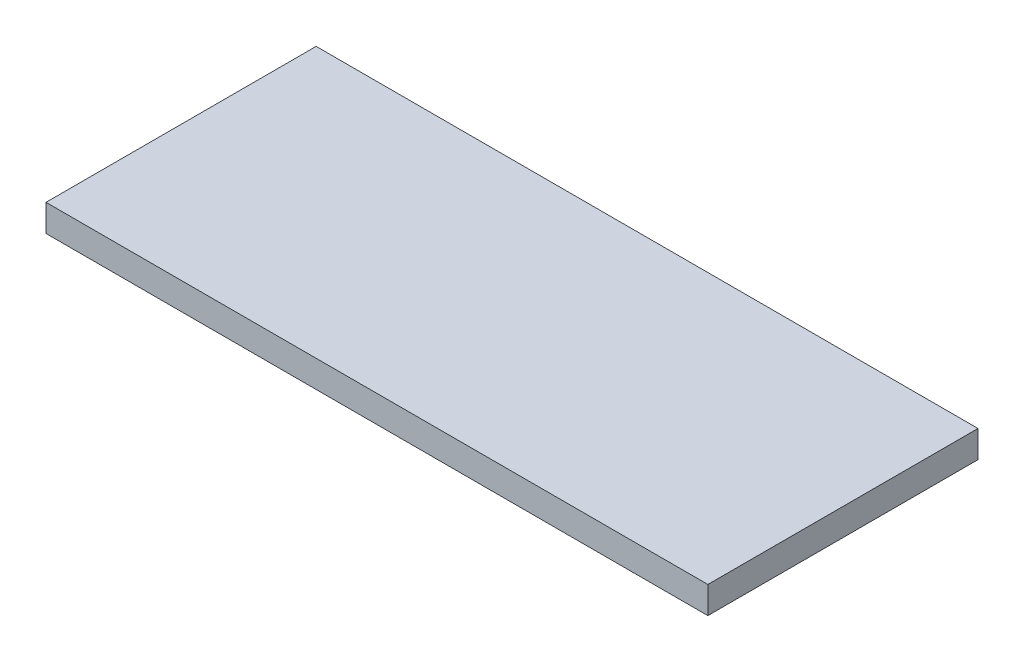
ISO-10303-21;
HEADER;
FILE_DESCRIPTION(('STEP AP214'),'2;1');
FILE_NAME('part.step','',(''),(''),'','','');
FILE_SCHEMA(('AUTOMOTIVE_DESIGN { 1 0 10303 214 1 1 1 1 }'));
ENDSEC;
DATA;
#1=APPLICATION_CONTEXT('core data for automotive mechanical design processes');
#2=APPLICATION_PROTOCOL_DEFINITION('international standard','automotive_design',2000,#1);
#3=PRODUCT_CONTEXT('',#1,'mechanical');
#4=PRODUCT('Part','Part','',(#3));
#5=PRODUCT_RELATED_PRODUCT_CATEGORY('part','',(#4));
#6=PRODUCT_DEFINITION_FORMATION('','',#4);
#7=PRODUCT_DEFINITION_CONTEXT('part definition',#1,'design');
#8=PRODUCT_DEFINITION('design','',#6,#7);
#9=PRODUCT_DEFINITION_SHAPE('','',#8);
#10=(LENGTH_UNIT() NAMED_UNIT(*) SI_UNIT(.MILLI.,.METRE.));
#11=(NAMED_UNIT(*) PLANE_ANGLE_UNIT() SI_UNIT($,.RADIAN.));
#12=(NAMED_UNIT(*) SI_UNIT($,.STERADIAN.) SOLID_ANGLE_UNIT());
#13=UNCERTAINTY_MEASURE_WITH_UNIT(LENGTH_MEASURE(1.E-05),#10,'distance_accuracy_value','');
#14=(GEOMETRIC_REPRESENTATION_CONTEXT(3) GLOBAL_UNCERTAINTY_ASSIGNED_CONTEXT((#13)) GLOBAL_UNIT_ASSIGNED_CONTEXT((#10,
#11,#12)) REPRESENTATION_CONTEXT('',''));
#15=CARTESIAN_POINT('',(0.,0.,0.));
#16=DIRECTION('',(0.,0.,1.));
#17=DIRECTION('',(1.,0.,0.));
#18=AXIS2_PLACEMENT_3D('',#15,#16,#17);
#19=CARTESIAN_POINT('',(31.115,2.54,12.7));
#20=DIRECTION('',(-1.,0.,0.));
#21=DIRECTION('',(0.,0.,1.));
#22=AXIS2_PLACEMENT_3D('',#19,#20,#21);
#23=PLANE('',#22);
#24=DIRECTION('',(0.,0.,-1.));
#25=VECTOR('',#24,1.);
#26=CARTESIAN_POINT('',(31.115,0.,12.7));
#27=LINE('',#26,#25);
#28=CARTESIAN_POINT('',(31.115,0.,12.7));
#29=VERTEX_POINT('',#28);
#30=CARTESIAN_POINT('',(31.115,0.,-12.7));
#31=VERTEX_POINT('',#30);
#32=EDGE_CURVE('E100',#29,#31,#27,.T.);
#33=ORIENTED_EDGE('',*,*,#32,.T.);
#34=DIRECTION('',(0.,-1.,0.));
#35=VECTOR('',#34,1.);
#36=CARTESIAN_POINT('',(31.115,2.54,-12.7));
#37=LINE('',#36,#35);
#38=CARTESIAN_POINT('',(31.115,2.54,-12.7));
#39=VERTEX_POINT('',#38);
#40=EDGE_CURVE('E11',#39,#31,#37,.T.);
#41=ORIENTED_EDGE('',*,*,#40,.F.);
#42=DIRECTION('',(0.,0.,-1.));
#43=VECTOR('',#42,1.);
#44=CARTESIAN_POINT('',(31.115,2.54,12.7));
#45=LINE('',#44,#43);
#46=CARTESIAN_POINT('',(31.115,2.54,12.7));
#47=VERTEX_POINT('',#46);
#48=EDGE_CURVE('E88',#47,#39,#45,.T.);
#49=ORIENTED_EDGE('',*,*,#48,.F.);
#50=DIRECTION('',(0.,-1.,0.));
#51=VECTOR('',#50,1.);
#52=CARTESIAN_POINT('',(31.115,2.54,12.7));
#53=LINE('',#52,#51);
#54=EDGE_CURVE('E96',#47,#29,#53,.T.);
#55=ORIENTED_EDGE('',*,*,#54,.T.);
#56=EDGE_LOOP('',(#33,#41,#49,#55));
#57=FACE_BOUND('',#56,.T.);
#58=ADVANCED_FACE('F37',(#57),#23,.F.);
#59=CARTESIAN_POINT('',(-31.115,2.54,-12.7));
#60=DIRECTION('',(0.,0.,1.));
#61=DIRECTION('',(1.,0.,0.));
#62=AXIS2_PLACEMENT_3D('',#59,#60,#61);
#63=PLANE('',#62);
#64=DIRECTION('',(-1.,0.,0.));
#65=VECTOR('',#64,1.);
#66=CARTESIAN_POINT('',(-31.115,0.,-12.7));
#67=LINE('',#66,#65);
#68=CARTESIAN_POINT('',(-31.115,0.,-12.7));
#69=VERTEX_POINT('',#68);
#70=EDGE_CURVE('E92',#31,#69,#67,.T.);
#71=ORIENTED_EDGE('',*,*,#70,.T.);
#72=DIRECTION('',(0.,-1.,0.));
#73=VECTOR('',#72,1.);
#74=CARTESIAN_POINT('',(-31.115,2.54,-12.7));
#75=LINE('',#74,#73);
#76=CARTESIAN_POINT('',(-31.115,2.54,-12.7));
#77=VERTEX_POINT('',#76);
#78=EDGE_CURVE('E45',#77,#69,#75,.T.);
#79=ORIENTED_EDGE('',*,*,#78,.F.);
#80=DIRECTION('',(-1.,0.,0.));
#81=VECTOR('',#80,1.);
#82=CARTESIAN_POINT('',(-31.115,2.54,-12.7));
#83=LINE('',#82,#81);
#84=EDGE_CURVE('E83',#39,#77,#83,.T.);
#85=ORIENTED_EDGE('',*,*,#84,.F.);
#86=ORIENTED_EDGE('',*,*,#40,.T.);
#87=EDGE_LOOP('',(#71,#79,#85,#86));
#88=FACE_BOUND('',#87,.T.);
#89=ADVANCED_FACE('F91',(#88),#63,.F.);
#90=CARTESIAN_POINT('',(-31.115,2.54,12.7));
#91=DIRECTION('',(1.,0.,0.));
#92=DIRECTION('',(0.,0.,-1.));
#93=AXIS2_PLACEMENT_3D('',#90,#91,#92);
#94=PLANE('',#93);
#95=DIRECTION('',(0.,0.,1.));
#96=VECTOR('',#95,1.);
#97=CARTESIAN_POINT('',(-31.115,0.,12.7));
#98=LINE('',#97,#96);
#99=CARTESIAN_POINT('',(-31.115,0.,12.7));
#100=VERTEX_POINT('',#99);
#101=EDGE_CURVE('E70',#69,#100,#98,.T.);
#102=ORIENTED_EDGE('',*,*,#101,.T.);
#103=DIRECTION('',(0.,-1.,0.));
#104=VECTOR('',#103,1.);
#105=CARTESIAN_POINT('',(-31.115,2.54,12.7));
#106=LINE('',#105,#104);
#107=CARTESIAN_POINT('',(-31.115,2.54,12.7));
#108=VERTEX_POINT('',#107);
#109=EDGE_CURVE('E93',#108,#100,#106,.T.);
#110=ORIENTED_EDGE('',*,*,#109,.F.);
#111=DIRECTION('',(0.,0.,1.));
#112=VECTOR('',#111,1.);
#113=CARTESIAN_POINT('',(-31.115,2.54,12.7));
#114=LINE('',#113,#112);
#115=EDGE_CURVE('E86',#77,#108,#114,.T.);
#116=ORIENTED_EDGE('',*,*,#115,.F.);
#117=ORIENTED_EDGE('',*,*,#78,.T.);
#118=EDGE_LOOP('',(#102,#110,#116,#117));
#119=FACE_BOUND('',#118,.T.);
#120=ADVANCED_FACE('F94',(#119),#94,.F.);
#121=CARTESIAN_POINT('',(-31.115,2.54,12.7));
#122=DIRECTION('',(0.,0.,-1.));
#123=DIRECTION('',(-1.,0.,0.));
#124=AXIS2_PLACEMENT_3D('',#121,#122,#123);
#125=PLANE('',#124);
#126=DIRECTION('',(1.,0.,0.));
#127=VECTOR('',#126,1.);
#128=CARTESIAN_POINT('',(-31.115,0.,12.7));
#129=LINE('',#128,#127);
#130=EDGE_CURVE('E76',#100,#29,#129,.T.);
#131=ORIENTED_EDGE('',*,*,#130,.T.);
#132=ORIENTED_EDGE('',*,*,#54,.F.);
#133=DIRECTION('',(1.,0.,0.));
#134=VECTOR('',#133,1.);
#135=CARTESIAN_POINT('',(-31.115,2.54,12.7));
#136=LINE('',#135,#134);
#137=EDGE_CURVE('E53',#108,#47,#136,.T.);
#138=ORIENTED_EDGE('',*,*,#137,.F.);
#139=ORIENTED_EDGE('',*,*,#109,.T.);
#140=EDGE_LOOP('',(#131,#132,#138,#139));
#141=FACE_BOUND('',#140,.T.);
#142=ADVANCED_FACE('F107',(#141),#125,.F.);
#143=CARTESIAN_POINT('',(0.,2.54,0.));
#144=DIRECTION('',(0.,-1.,0.));
#145=DIRECTION('',(0.,0.,-1.));
#146=AXIS2_PLACEMENT_3D('',#143,#144,#145);
#147=PLANE('',#146);
#148=ORIENTED_EDGE('',*,*,#48,.T.);
#149=ORIENTED_EDGE('',*,*,#84,.T.);
#150=ORIENTED_EDGE('',*,*,#115,.T.);
#151=ORIENTED_EDGE('',*,*,#137,.T.);
#152=EDGE_LOOP('',(#148,#149,#150,#151));
#153=FACE_BOUND('',#152,.T.);
#154=ADVANCED_FACE('F84',(#153),#147,.F.);
#155=CARTESIAN_POINT('',(0.,0.,0.));
#156=DIRECTION('',(0.,-1.,0.));
#157=DIRECTION('',(0.,0.,-1.));
#158=AXIS2_PLACEMENT_3D('',#155,#156,#157);
#159=PLANE('',#158);
#160=ORIENTED_EDGE('',*,*,#32,.F.);
#161=ORIENTED_EDGE('',*,*,#130,.F.);
#162=ORIENTED_EDGE('',*,*,#101,.F.);
#163=ORIENTED_EDGE('',*,*,#70,.F.);
#164=EDGE_LOOP('',(#160,#161,#162,#163));
#165=FACE_BOUND('',#164,.T.);
#166=ADVANCED_FACE('F110',(#165),#159,.T.);
#167=CLOSED_SHELL('',(#58,#89,#120,#142,#154,#166));
#168=MANIFOLD_SOLID_BREP('B2',#167);
#169=ADVANCED_BREP_SHAPE_REPRESENTATION('',(#18,#168),#14);
#170=SHAPE_DEFINITION_REPRESENTATION(#9,#169);
ENDSEC;
END-ISO-10303-21;
